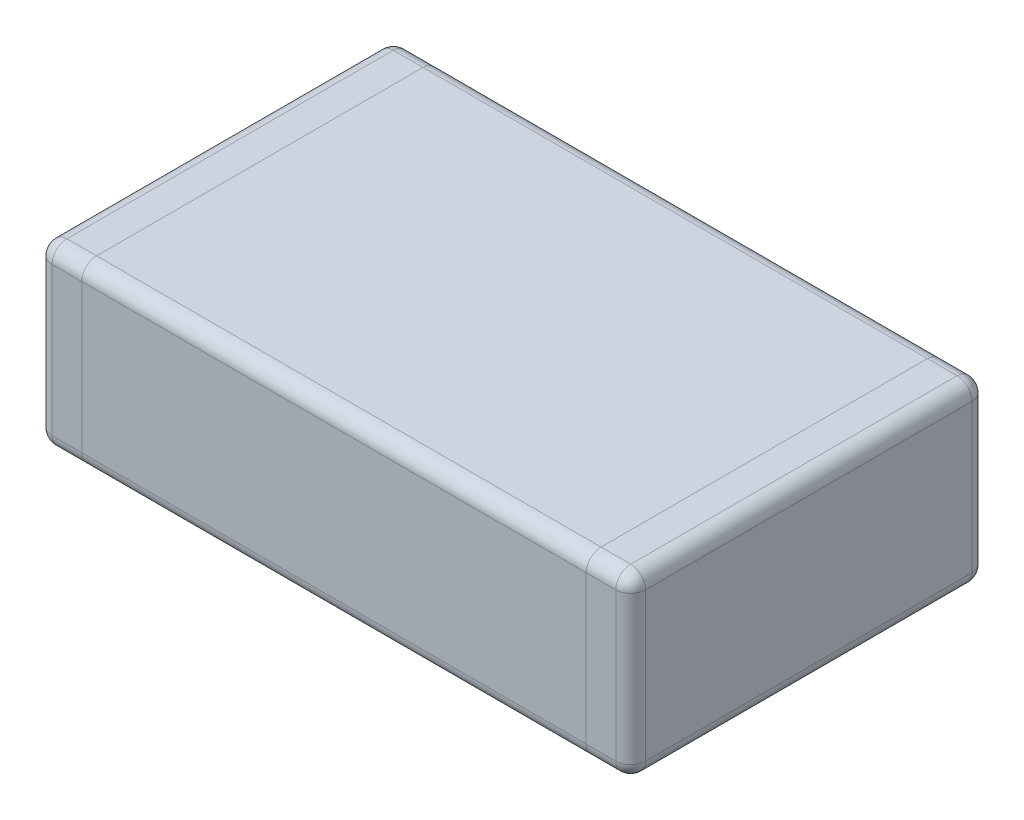
ISO-10303-21;
HEADER;
FILE_DESCRIPTION(('STEP AP214'),'2;1');
FILE_NAME('part.step','',(''),(''),'','','');
FILE_SCHEMA(('AUTOMOTIVE_DESIGN { 1 0 10303 214 1 1 1 1 }'));
ENDSEC;
DATA;
#1=APPLICATION_CONTEXT('core data for automotive mechanical design processes');
#2=APPLICATION_PROTOCOL_DEFINITION('international standard','automotive_design',2000,#1);
#3=PRODUCT_CONTEXT('',#1,'mechanical');
#4=PRODUCT('Part','Part','',(#3));
#5=PRODUCT_RELATED_PRODUCT_CATEGORY('part','',(#4));
#6=PRODUCT_DEFINITION_FORMATION('','',#4);
#7=PRODUCT_DEFINITION_CONTEXT('part definition',#1,'design');
#8=PRODUCT_DEFINITION('design','',#6,#7);
#9=PRODUCT_DEFINITION_SHAPE('','',#8);
#10=(LENGTH_UNIT() NAMED_UNIT(*) SI_UNIT(.MILLI.,.METRE.));
#11=(NAMED_UNIT(*) PLANE_ANGLE_UNIT() SI_UNIT($,.RADIAN.));
#12=(NAMED_UNIT(*) SI_UNIT($,.STERADIAN.) SOLID_ANGLE_UNIT());
#13=UNCERTAINTY_MEASURE_WITH_UNIT(LENGTH_MEASURE(1.E-05),#10,'distance_accuracy_value','');
#14=(GEOMETRIC_REPRESENTATION_CONTEXT(3) GLOBAL_UNCERTAINTY_ASSIGNED_CONTEXT((#13)) GLOBAL_UNIT_ASSIGNED_CONTEXT((#10,
#11,#12)) REPRESENTATION_CONTEXT('',''));
#15=CARTESIAN_POINT('',(0.,0.,0.));
#16=DIRECTION('',(0.,0.,1.));
#17=DIRECTION('',(1.,0.,0.));
#18=AXIS2_PLACEMENT_3D('',#15,#16,#17);
#19=CARTESIAN_POINT('',(1.,0.6,-0.6));
#20=DIRECTION('',(0.,-1.,0.));
#21=DIRECTION('',(0.,0.,-1.));
#22=AXIS2_PLACEMENT_3D('',#19,#20,#21);
#23=PLANE('',#22);
#24=DIRECTION('',(0.,0.,1.));
#25=VECTOR('',#24,1.);
#26=CARTESIAN_POINT('',(-0.85,0.6,-0.6));
#27=LINE('',#26,#25);
#28=CARTESIAN_POINT('',(-0.85,0.6,-0.55));
#29=VERTEX_POINT('',#28);
#30=CARTESIAN_POINT('',(-0.85,0.6,0.55));
#31=VERTEX_POINT('',#30);
#32=EDGE_CURVE('E11',#29,#31,#27,.T.);
#33=ORIENTED_EDGE('',*,*,#32,.F.);
#34=DIRECTION('',(-1.,0.,0.));
#35=VECTOR('',#34,1.);
#36=CARTESIAN_POINT('',(1.,0.6,-0.55));
#37=LINE('',#36,#35);
#38=CARTESIAN_POINT('',(-0.95,0.6,-0.55));
#39=VERTEX_POINT('',#38);
#40=EDGE_CURVE('E286',#29,#39,#37,.T.);
#41=ORIENTED_EDGE('',*,*,#40,.T.);
#42=DIRECTION('',(0.,0.,1.));
#43=VECTOR('',#42,1.);
#44=CARTESIAN_POINT('',(-0.95,0.6,-0.6));
#45=LINE('',#44,#43);
#46=CARTESIAN_POINT('',(-0.95,0.6,0.55));
#47=VERTEX_POINT('',#46);
#48=EDGE_CURVE('E290',#39,#47,#45,.T.);
#49=ORIENTED_EDGE('',*,*,#48,.T.);
#50=DIRECTION('',(1.,0.,0.));
#51=VECTOR('',#50,1.);
#52=CARTESIAN_POINT('',(1.,0.6,0.55));
#53=LINE('',#52,#51);
#54=EDGE_CURVE('E295',#47,#31,#53,.T.);
#55=ORIENTED_EDGE('',*,*,#54,.T.);
#56=EDGE_LOOP('',(#33,#41,#49,#55));
#57=FACE_BOUND('',#56,.T.);
#58=ADVANCED_FACE('F47',(#57),#23,.F.);
#59=DIRECTION('',(0.,0.,-1.));
#60=VECTOR('',#59,1.);
#61=CARTESIAN_POINT('',(0.85,0.6,-0.6));
#62=LINE('',#61,#60);
#63=CARTESIAN_POINT('',(0.85,0.6,0.55));
#64=VERTEX_POINT('',#63);
#65=CARTESIAN_POINT('',(0.85,0.6,-0.55));
#66=VERTEX_POINT('',#65);
#67=EDGE_CURVE('E57',#64,#66,#62,.T.);
#68=ORIENTED_EDGE('',*,*,#67,.F.);
#69=CARTESIAN_POINT('',(0.95,0.6,0.55));
#70=VERTEX_POINT('',#69);
#71=EDGE_CURVE('E294',#64,#70,#53,.T.);
#72=ORIENTED_EDGE('',*,*,#71,.T.);
#73=DIRECTION('',(0.,0.,-1.));
#74=VECTOR('',#73,1.);
#75=CARTESIAN_POINT('',(0.95,0.6,-0.6));
#76=LINE('',#75,#74);
#77=CARTESIAN_POINT('',(0.95,0.6,-0.55));
#78=VERTEX_POINT('',#77);
#79=EDGE_CURVE('E282',#70,#78,#76,.T.);
#80=ORIENTED_EDGE('',*,*,#79,.T.);
#81=EDGE_CURVE('E287',#78,#66,#37,.T.);
#82=ORIENTED_EDGE('',*,*,#81,.T.);
#83=EDGE_LOOP('',(#68,#72,#80,#82));
#84=FACE_BOUND('',#83,.T.);
#85=ADVANCED_FACE('F602',(#84),#23,.F.);
#86=CARTESIAN_POINT('',(1.,0.55,0.55));
#87=DIRECTION('',(1.,0.,0.));
#88=DIRECTION('',(0.,0.,-1.));
#89=AXIS2_PLACEMENT_3D('',#86,#87,#88);
#90=CYLINDRICAL_SURFACE('',#89,0.05);
#91=DIRECTION('',(1.,0.,0.));
#92=VECTOR('',#91,1.);
#93=CARTESIAN_POINT('',(-1.,0.55,0.6));
#94=LINE('',#93,#92);
#95=CARTESIAN_POINT('',(-0.85,0.55,0.6));
#96=VERTEX_POINT('',#95);
#97=CARTESIAN_POINT('',(-0.95,0.55,0.6));
#98=VERTEX_POINT('',#97);
#99=EDGE_CURVE('E277',#96,#98,#94,.F.);
#100=ORIENTED_EDGE('',*,*,#99,.F.);
#101=CARTESIAN_POINT('',(-0.85,0.55,0.55));
#102=DIRECTION('',(1.,0.,0.));
#103=DIRECTION('',(0.,0.,-1.));
#104=AXIS2_PLACEMENT_3D('',#101,#102,#103);
#105=CIRCLE('',#104,0.05);
#106=EDGE_CURVE('E416',#96,#31,#105,.F.);
#107=ORIENTED_EDGE('',*,*,#106,.T.);
#108=ORIENTED_EDGE('',*,*,#54,.F.);
#109=CARTESIAN_POINT('',(-0.95,0.55,0.55));
#110=DIRECTION('',(-1.,0.,0.));
#111=DIRECTION('',(0.,-1.,0.));
#112=AXIS2_PLACEMENT_3D('',#109,#110,#111);
#113=CIRCLE('',#112,0.05);
#114=EDGE_CURVE('E389',#47,#98,#113,.F.);
#115=ORIENTED_EDGE('',*,*,#114,.T.);
#116=EDGE_LOOP('',(#100,#107,#108,#115));
#117=FACE_BOUND('',#116,.T.);
#118=ADVANCED_FACE('F591',(#117),#90,.T.);
#119=ORIENTED_EDGE('',*,*,#71,.F.);
#120=CARTESIAN_POINT('',(0.85,0.55,0.55));
#121=DIRECTION('',(-1.,0.,0.));
#122=DIRECTION('',(0.,0.,1.));
#123=AXIS2_PLACEMENT_3D('',#120,#121,#122);
#124=CIRCLE('',#123,0.05);
#125=CARTESIAN_POINT('',(0.85,0.55,0.6));
#126=VERTEX_POINT('',#125);
#127=EDGE_CURVE('E415',#64,#126,#124,.F.);
#128=ORIENTED_EDGE('',*,*,#127,.T.);
#129=CARTESIAN_POINT('',(0.95,0.55,0.6));
#130=VERTEX_POINT('',#129);
#131=EDGE_CURVE('E278',#130,#126,#94,.F.);
#132=ORIENTED_EDGE('',*,*,#131,.F.);
#133=CARTESIAN_POINT('',(0.95,0.55,0.55));
#134=DIRECTION('',(1.,0.,0.));
#135=DIRECTION('',(0.,0.,-1.));
#136=AXIS2_PLACEMENT_3D('',#133,#134,#135);
#137=CIRCLE('',#136,0.05);
#138=EDGE_CURVE('E369',#70,#130,#137,.T.);
#139=ORIENTED_EDGE('',*,*,#138,.F.);
#140=EDGE_LOOP('',(#119,#128,#132,#139));
#141=FACE_BOUND('',#140,.T.);
#142=ADVANCED_FACE('F615',(#141),#90,.T.);
#143=CARTESIAN_POINT('',(-1.,0.6,0.6));
#144=DIRECTION('',(0.,0.,-1.));
#145=DIRECTION('',(-1.,0.,0.));
#146=AXIS2_PLACEMENT_3D('',#143,#144,#145);
#147=PLANE('',#146);
#148=DIRECTION('',(0.,-1.,0.));
#149=VECTOR('',#148,1.);
#150=CARTESIAN_POINT('',(-0.85,0.6,0.6));
#151=LINE('',#150,#149);
#152=CARTESIAN_POINT('',(-0.85,0.05,0.6));
#153=VERTEX_POINT('',#152);
#154=EDGE_CURVE('E411',#96,#153,#151,.T.);
#155=ORIENTED_EDGE('',*,*,#154,.F.);
#156=ORIENTED_EDGE('',*,*,#99,.T.);
#157=DIRECTION('',(0.,-1.,0.));
#158=VECTOR('',#157,1.);
#159=CARTESIAN_POINT('',(-0.95,0.6,0.6));
#160=LINE('',#159,#158);
#161=CARTESIAN_POINT('',(-0.95,0.05,0.6));
#162=VERTEX_POINT('',#161);
#163=EDGE_CURVE('E273',#98,#162,#160,.T.);
#164=ORIENTED_EDGE('',*,*,#163,.T.);
#165=DIRECTION('',(1.,0.,0.));
#166=VECTOR('',#165,1.);
#167=CARTESIAN_POINT('',(1.,0.05,0.6));
#168=LINE('',#167,#166);
#169=EDGE_CURVE('E265',#162,#153,#168,.T.);
#170=ORIENTED_EDGE('',*,*,#169,.T.);
#171=EDGE_LOOP('',(#155,#156,#164,#170));
#172=FACE_BOUND('',#171,.T.);
#173=ADVANCED_FACE('F662',(#172),#147,.F.);
#174=DIRECTION('',(0.,1.,0.));
#175=VECTOR('',#174,1.);
#176=CARTESIAN_POINT('',(0.85,0.6,0.6));
#177=LINE('',#176,#175);
#178=CARTESIAN_POINT('',(0.85,0.05,0.6));
#179=VERTEX_POINT('',#178);
#180=EDGE_CURVE('E407',#179,#126,#177,.T.);
#181=ORIENTED_EDGE('',*,*,#180,.F.);
#182=CARTESIAN_POINT('',(0.95,0.05,0.6));
#183=VERTEX_POINT('',#182);
#184=EDGE_CURVE('E264',#179,#183,#168,.T.);
#185=ORIENTED_EDGE('',*,*,#184,.T.);
#186=DIRECTION('',(0.,-1.,0.));
#187=VECTOR('',#186,1.);
#188=CARTESIAN_POINT('',(0.95,0.6,0.6));
#189=LINE('',#188,#187);
#190=EDGE_CURVE('E269',#183,#130,#189,.F.);
#191=ORIENTED_EDGE('',*,*,#190,.T.);
#192=ORIENTED_EDGE('',*,*,#131,.T.);
#193=EDGE_LOOP('',(#181,#185,#191,#192));
#194=FACE_BOUND('',#193,.T.);
#195=ADVANCED_FACE('F663',(#194),#147,.F.);
#196=CARTESIAN_POINT('',(-1.,0.05,0.55));
#197=DIRECTION('',(-1.,0.,0.));
#198=DIRECTION('',(0.,0.,1.));
#199=AXIS2_PLACEMENT_3D('',#196,#197,#198);
#200=CYLINDRICAL_SURFACE('',#199,0.05);
#201=DIRECTION('',(1.,0.,0.));
#202=VECTOR('',#201,1.);
#203=CARTESIAN_POINT('',(-1.,0.,0.55));
#204=LINE('',#203,#202);
#205=CARTESIAN_POINT('',(-0.85,0.,0.55));
#206=VERTEX_POINT('',#205);
#207=CARTESIAN_POINT('',(-0.95,0.,0.55));
#208=VERTEX_POINT('',#207);
#209=EDGE_CURVE('E303',#206,#208,#204,.F.);
#210=ORIENTED_EDGE('',*,*,#209,.F.);
#211=CARTESIAN_POINT('',(-0.85,0.05,0.55));
#212=DIRECTION('',(1.,0.,0.));
#213=DIRECTION('',(0.,0.,-1.));
#214=AXIS2_PLACEMENT_3D('',#211,#212,#213);
#215=CIRCLE('',#214,0.05);
#216=EDGE_CURVE('E412',#206,#153,#215,.F.);
#217=ORIENTED_EDGE('',*,*,#216,.T.);
#218=ORIENTED_EDGE('',*,*,#169,.F.);
#219=CARTESIAN_POINT('',(-0.95,0.05,0.55));
#220=DIRECTION('',(-1.,0.,0.));
#221=DIRECTION('',(0.,0.,1.));
#222=AXIS2_PLACEMENT_3D('',#219,#220,#221);
#223=CIRCLE('',#222,0.05);
#224=EDGE_CURVE('E377',#162,#208,#223,.F.);
#225=ORIENTED_EDGE('',*,*,#224,.T.);
#226=EDGE_LOOP('',(#210,#217,#218,#225));
#227=FACE_BOUND('',#226,.T.);
#228=ADVANCED_FACE('F672',(#227),#200,.T.);
#229=ORIENTED_EDGE('',*,*,#184,.F.);
#230=CARTESIAN_POINT('',(0.85,0.05,0.55));
#231=DIRECTION('',(-1.,0.,0.));
#232=DIRECTION('',(0.,0.,1.));
#233=AXIS2_PLACEMENT_3D('',#230,#231,#232);
#234=CIRCLE('',#233,0.05);
#235=CARTESIAN_POINT('',(0.85,0.,0.55));
#236=VERTEX_POINT('',#235);
#237=EDGE_CURVE('E427',#179,#236,#234,.F.);
#238=ORIENTED_EDGE('',*,*,#237,.T.);
#239=CARTESIAN_POINT('',(0.95,0.,0.55));
#240=VERTEX_POINT('',#239);
#241=EDGE_CURVE('E304',#240,#236,#204,.F.);
#242=ORIENTED_EDGE('',*,*,#241,.F.);
#243=CARTESIAN_POINT('',(0.95,0.05,0.55));
#244=DIRECTION('',(1.,0.,0.));
#245=DIRECTION('',(0.,0.,-1.));
#246=AXIS2_PLACEMENT_3D('',#243,#244,#245);
#247=CIRCLE('',#246,0.05);
#248=EDGE_CURVE('E350',#183,#240,#247,.T.);
#249=ORIENTED_EDGE('',*,*,#248,.F.);
#250=EDGE_LOOP('',(#229,#238,#242,#249));
#251=FACE_BOUND('',#250,.T.);
#252=ADVANCED_FACE('F631',(#251),#200,.T.);
#253=CARTESIAN_POINT('',(1.,0.,-0.6));
#254=DIRECTION('',(0.,-1.,0.));
#255=DIRECTION('',(0.,0.,-1.));
#256=AXIS2_PLACEMENT_3D('',#253,#254,#255);
#257=PLANE('',#256);
#258=DIRECTION('',(-1.,0.,0.));
#259=VECTOR('',#258,1.);
#260=CARTESIAN_POINT('',(1.,0.,-0.55));
#261=LINE('',#260,#259);
#262=CARTESIAN_POINT('',(-0.95,0.,-0.55));
#263=VERTEX_POINT('',#262);
#264=CARTESIAN_POINT('',(-0.85,0.,-0.55));
#265=VERTEX_POINT('',#264);
#266=EDGE_CURVE('E313',#263,#265,#261,.F.);
#267=ORIENTED_EDGE('',*,*,#266,.T.);
#268=DIRECTION('',(0.,0.,1.));
#269=VECTOR('',#268,1.);
#270=CARTESIAN_POINT('',(-0.85,0.,-0.6));
#271=LINE('',#270,#269);
#272=EDGE_CURVE('E428',#265,#206,#271,.T.);
#273=ORIENTED_EDGE('',*,*,#272,.T.);
#274=ORIENTED_EDGE('',*,*,#209,.T.);
#275=DIRECTION('',(0.,0.,1.));
#276=VECTOR('',#275,1.);
#277=CARTESIAN_POINT('',(-0.95,0.,-0.6));
#278=LINE('',#277,#276);
#279=EDGE_CURVE('E308',#208,#263,#278,.F.);
#280=ORIENTED_EDGE('',*,*,#279,.T.);
#281=EDGE_LOOP('',(#267,#273,#274,#280));
#282=FACE_BOUND('',#281,.T.);
#283=ADVANCED_FACE('F659',(#282),#257,.T.);
#284=ORIENTED_EDGE('',*,*,#241,.T.);
#285=DIRECTION('',(0.,0.,-1.));
#286=VECTOR('',#285,1.);
#287=CARTESIAN_POINT('',(0.85,0.,-0.6));
#288=LINE('',#287,#286);
#289=CARTESIAN_POINT('',(0.85,0.,-0.55));
#290=VERTEX_POINT('',#289);
#291=EDGE_CURVE('E422',#236,#290,#288,.T.);
#292=ORIENTED_EDGE('',*,*,#291,.T.);
#293=CARTESIAN_POINT('',(0.95,0.,-0.55));
#294=VERTEX_POINT('',#293);
#295=EDGE_CURVE('E312',#290,#294,#261,.F.);
#296=ORIENTED_EDGE('',*,*,#295,.T.);
#297=DIRECTION('',(0.,0.,-1.));
#298=VECTOR('',#297,1.);
#299=CARTESIAN_POINT('',(0.95,0.,0.6));
#300=LINE('',#299,#298);
#301=EDGE_CURVE('E299',#294,#240,#300,.F.);
#302=ORIENTED_EDGE('',*,*,#301,.T.);
#303=EDGE_LOOP('',(#284,#292,#296,#302));
#304=FACE_BOUND('',#303,.T.);
#305=ADVANCED_FACE('F449',(#304),#257,.T.);
#306=CARTESIAN_POINT('',(1.,0.55,-0.55));
#307=DIRECTION('',(-1.,0.,0.));
#308=DIRECTION('',(0.,0.,1.));
#309=AXIS2_PLACEMENT_3D('',#306,#307,#308);
#310=CYLINDRICAL_SURFACE('',#309,0.05);
#311=ORIENTED_EDGE('',*,*,#40,.F.);
#312=CARTESIAN_POINT('',(-0.85,0.55,-0.55));
#313=DIRECTION('',(1.,0.,0.));
#314=DIRECTION('',(0.,0.,-1.));
#315=AXIS2_PLACEMENT_3D('',#312,#313,#314);
#316=CIRCLE('',#315,0.05);
#317=CARTESIAN_POINT('',(-0.85,0.55,-0.6));
#318=VERTEX_POINT('',#317);
#319=EDGE_CURVE('E419',#29,#318,#316,.F.);
#320=ORIENTED_EDGE('',*,*,#319,.T.);
#321=DIRECTION('',(-1.,0.,0.));
#322=VECTOR('',#321,1.);
#323=CARTESIAN_POINT('',(-1.,0.55,-0.6));
#324=LINE('',#323,#322);
#325=CARTESIAN_POINT('',(-0.95,0.55,-0.6));
#326=VERTEX_POINT('',#325);
#327=EDGE_CURVE('E234',#326,#318,#324,.F.);
#328=ORIENTED_EDGE('',*,*,#327,.F.);
#329=CARTESIAN_POINT('',(-0.95,0.55,-0.55));
#330=DIRECTION('',(-1.,0.,0.));
#331=DIRECTION('',(0.,0.,1.));
#332=AXIS2_PLACEMENT_3D('',#329,#330,#331);
#333=CIRCLE('',#332,0.05);
#334=EDGE_CURVE('E338',#326,#39,#333,.F.);
#335=ORIENTED_EDGE('',*,*,#334,.T.);
#336=EDGE_LOOP('',(#311,#320,#328,#335));
#337=FACE_BOUND('',#336,.T.);
#338=ADVANCED_FACE('F568',(#337),#310,.T.);
#339=CARTESIAN_POINT('',(0.85,0.55,-0.6));
#340=VERTEX_POINT('',#339);
#341=CARTESIAN_POINT('',(0.95,0.55,-0.6));
#342=VERTEX_POINT('',#341);
#343=EDGE_CURVE('E224',#340,#342,#324,.F.);
#344=ORIENTED_EDGE('',*,*,#343,.F.);
#345=CARTESIAN_POINT('',(0.85,0.55,-0.55));
#346=DIRECTION('',(-1.,0.,0.));
#347=DIRECTION('',(0.,0.,1.));
#348=AXIS2_PLACEMENT_3D('',#345,#346,#347);
#349=CIRCLE('',#348,0.05);
#350=EDGE_CURVE('E423',#340,#66,#349,.F.);
#351=ORIENTED_EDGE('',*,*,#350,.T.);
#352=ORIENTED_EDGE('',*,*,#81,.F.);
#353=CARTESIAN_POINT('',(0.95,0.55,-0.55));
#354=DIRECTION('',(1.,0.,0.));
#355=DIRECTION('',(0.,1.,0.));
#356=AXIS2_PLACEMENT_3D('',#353,#354,#355);
#357=CIRCLE('',#356,0.05);
#358=EDGE_CURVE('E208',#342,#78,#357,.T.);
#359=ORIENTED_EDGE('',*,*,#358,.F.);
#360=EDGE_LOOP('',(#344,#351,#352,#359));
#361=FACE_BOUND('',#360,.T.);
#362=ADVANCED_FACE('F745',(#361),#310,.T.);
#363=CARTESIAN_POINT('',(-1.,0.05,-0.55));
#364=DIRECTION('',(1.,0.,0.));
#365=DIRECTION('',(0.,0.,-1.));
#366=AXIS2_PLACEMENT_3D('',#363,#364,#365);
#367=CYLINDRICAL_SURFACE('',#366,0.05);
#368=DIRECTION('',(-1.,0.,0.));
#369=VECTOR('',#368,1.);
#370=CARTESIAN_POINT('',(-1.,0.05,-0.6));
#371=LINE('',#370,#369);
#372=CARTESIAN_POINT('',(-0.85,0.05,-0.6));
#373=VERTEX_POINT('',#372);
#374=CARTESIAN_POINT('',(-0.95,0.05,-0.6));
#375=VERTEX_POINT('',#374);
#376=EDGE_CURVE('E221',#373,#375,#371,.T.);
#377=ORIENTED_EDGE('',*,*,#376,.F.);
#378=CARTESIAN_POINT('',(-0.85,0.05,-0.55));
#379=DIRECTION('',(1.,0.,0.));
#380=DIRECTION('',(0.,0.,-1.));
#381=AXIS2_PLACEMENT_3D('',#378,#379,#380);
#382=CIRCLE('',#381,0.05);
#383=EDGE_CURVE('E432',#373,#265,#382,.F.);
#384=ORIENTED_EDGE('',*,*,#383,.T.);
#385=ORIENTED_EDGE('',*,*,#266,.F.);
#386=CARTESIAN_POINT('',(-0.95,0.05,-0.55));
#387=DIRECTION('',(-1.,0.,0.));
#388=DIRECTION('',(0.,0.,1.));
#389=AXIS2_PLACEMENT_3D('',#386,#387,#388);
#390=CIRCLE('',#389,0.05);
#391=EDGE_CURVE('E334',#263,#375,#390,.F.);
#392=ORIENTED_EDGE('',*,*,#391,.T.);
#393=EDGE_LOOP('',(#377,#384,#385,#392));
#394=FACE_BOUND('',#393,.T.);
#395=ADVANCED_FACE('F709',(#394),#367,.T.);
#396=ORIENTED_EDGE('',*,*,#295,.F.);
#397=CARTESIAN_POINT('',(0.85,0.05,-0.55));
#398=DIRECTION('',(-1.,0.,0.));
#399=DIRECTION('',(0.,0.,1.));
#400=AXIS2_PLACEMENT_3D('',#397,#398,#399);
#401=CIRCLE('',#400,0.05);
#402=CARTESIAN_POINT('',(0.85,0.05,-0.6));
#403=VERTEX_POINT('',#402);
#404=EDGE_CURVE('E51',#290,#403,#401,.F.);
#405=ORIENTED_EDGE('',*,*,#404,.T.);
#406=CARTESIAN_POINT('',(0.95,0.05,-0.6));
#407=VERTEX_POINT('',#406);
#408=EDGE_CURVE('E211',#407,#403,#371,.T.);
#409=ORIENTED_EDGE('',*,*,#408,.F.);
#410=CARTESIAN_POINT('',(0.95,0.05,-0.55));
#411=DIRECTION('',(1.,0.,0.));
#412=DIRECTION('',(0.,0.,-1.));
#413=AXIS2_PLACEMENT_3D('',#410,#411,#412);
#414=CIRCLE('',#413,0.05);
#415=EDGE_CURVE('E199',#294,#407,#414,.T.);
#416=ORIENTED_EDGE('',*,*,#415,.F.);
#417=EDGE_LOOP('',(#396,#405,#409,#416));
#418=FACE_BOUND('',#417,.T.);
#419=ADVANCED_FACE('F212',(#418),#367,.T.);
#420=CARTESIAN_POINT('',(-1.,0.6,-0.6));
#421=DIRECTION('',(0.,0.,1.));
#422=DIRECTION('',(1.,0.,0.));
#423=AXIS2_PLACEMENT_3D('',#420,#421,#422);
#424=PLANE('',#423);
#425=DIRECTION('',(0.,1.,0.));
#426=VECTOR('',#425,1.);
#427=CARTESIAN_POINT('',(-0.85,0.6,-0.6));
#428=LINE('',#427,#426);
#429=EDGE_CURVE('E403',#373,#318,#428,.T.);
#430=ORIENTED_EDGE('',*,*,#429,.F.);
#431=ORIENTED_EDGE('',*,*,#376,.T.);
#432=DIRECTION('',(0.,-1.,0.));
#433=VECTOR('',#432,1.);
#434=CARTESIAN_POINT('',(-0.95,0.6,-0.6));
#435=LINE('',#434,#433);
#436=EDGE_CURVE('E218',#375,#326,#435,.F.);
#437=ORIENTED_EDGE('',*,*,#436,.T.);
#438=ORIENTED_EDGE('',*,*,#327,.T.);
#439=EDGE_LOOP('',(#430,#431,#437,#438));
#440=FACE_BOUND('',#439,.T.);
#441=ADVANCED_FACE('F571',(#440),#424,.F.);
#442=DIRECTION('',(0.,-1.,0.));
#443=VECTOR('',#442,1.);
#444=CARTESIAN_POINT('',(0.85,0.6,-0.6));
#445=LINE('',#444,#443);
#446=EDGE_CURVE('E316',#340,#403,#445,.T.);
#447=ORIENTED_EDGE('',*,*,#446,.F.);
#448=ORIENTED_EDGE('',*,*,#343,.T.);
#449=DIRECTION('',(0.,-1.,0.));
#450=VECTOR('',#449,1.);
#451=CARTESIAN_POINT('',(0.95,0.6,-0.6));
#452=LINE('',#451,#450);
#453=EDGE_CURVE('E190',#342,#407,#452,.T.);
#454=ORIENTED_EDGE('',*,*,#453,.T.);
#455=ORIENTED_EDGE('',*,*,#408,.T.);
#456=EDGE_LOOP('',(#447,#448,#454,#455));
#457=FACE_BOUND('',#456,.T.);
#458=ADVANCED_FACE('F222',(#457),#424,.F.);
#459=CARTESIAN_POINT('',(1.,0.6,0.6));
#460=DIRECTION('',(-1.,0.,0.));
#461=DIRECTION('',(0.,0.,1.));
#462=AXIS2_PLACEMENT_3D('',#459,#460,#461);
#463=PLANE('',#462);
#464=DIRECTION('',(0.,-1.,0.));
#465=VECTOR('',#464,1.);
#466=CARTESIAN_POINT('',(1.,0.6,-0.55));
#467=LINE('',#466,#465);
#468=CARTESIAN_POINT('',(1.,0.05,-0.55));
#469=VERTEX_POINT('',#468);
#470=CARTESIAN_POINT('',(1.,0.55,-0.55));
#471=VERTEX_POINT('',#470);
#472=EDGE_CURVE('E192',#469,#471,#467,.F.);
#473=ORIENTED_EDGE('',*,*,#472,.T.);
#474=DIRECTION('',(0.,0.,-1.));
#475=VECTOR('',#474,1.);
#476=CARTESIAN_POINT('',(1.,0.55,0.6));
#477=LINE('',#476,#475);
#478=CARTESIAN_POINT('',(1.,0.55,0.55));
#479=VERTEX_POINT('',#478);
#480=EDGE_CURVE('E248',#471,#479,#477,.F.);
#481=ORIENTED_EDGE('',*,*,#480,.T.);
#482=DIRECTION('',(0.,-1.,0.));
#483=VECTOR('',#482,1.);
#484=CARTESIAN_POINT('',(1.,0.6,0.55));
#485=LINE('',#484,#483);
#486=CARTESIAN_POINT('',(1.,0.05,0.55));
#487=VERTEX_POINT('',#486);
#488=EDGE_CURVE('E243',#479,#487,#485,.T.);
#489=ORIENTED_EDGE('',*,*,#488,.T.);
#490=DIRECTION('',(0.,0.,-1.));
#491=VECTOR('',#490,1.);
#492=CARTESIAN_POINT('',(1.,0.05,-0.6));
#493=LINE('',#492,#491);
#494=EDGE_CURVE('E240',#487,#469,#493,.T.);
#495=ORIENTED_EDGE('',*,*,#494,.T.);
#496=EDGE_LOOP('',(#473,#481,#489,#495));
#497=FACE_BOUND('',#496,.T.);
#498=ADVANCED_FACE('F625',(#497),#463,.F.);
#499=EDGE_CURVE('E219',#403,#373,#371,.T.);
#500=ORIENTED_EDGE('',*,*,#499,.T.);
#501=ORIENTED_EDGE('',*,*,#429,.T.);
#502=EDGE_CURVE('E232',#318,#340,#324,.F.);
#503=ORIENTED_EDGE('',*,*,#502,.T.);
#504=ORIENTED_EDGE('',*,*,#446,.T.);
#505=EDGE_LOOP('',(#500,#501,#503,#504));
#506=FACE_BOUND('',#505,.T.);
#507=ADVANCED_FACE('F667',(#506),#424,.F.);
#508=CARTESIAN_POINT('',(-1.,0.6,0.6));
#509=DIRECTION('',(1.,0.,0.));
#510=DIRECTION('',(0.,0.,-1.));
#511=AXIS2_PLACEMENT_3D('',#508,#509,#510);
#512=PLANE('',#511);
#513=DIRECTION('',(0.,-1.,0.));
#514=VECTOR('',#513,1.);
#515=CARTESIAN_POINT('',(-1.,0.6,0.55));
#516=LINE('',#515,#514);
#517=CARTESIAN_POINT('',(-1.,0.05,0.55));
#518=VERTEX_POINT('',#517);
#519=CARTESIAN_POINT('',(-1.,0.55,0.55));
#520=VERTEX_POINT('',#519);
#521=EDGE_CURVE('E254',#518,#520,#516,.F.);
#522=ORIENTED_EDGE('',*,*,#521,.T.);
#523=DIRECTION('',(0.,0.,1.));
#524=VECTOR('',#523,1.);
#525=CARTESIAN_POINT('',(-1.,0.55,0.6));
#526=LINE('',#525,#524);
#527=CARTESIAN_POINT('',(-1.,0.55,-0.55));
#528=VERTEX_POINT('',#527);
#529=EDGE_CURVE('E261',#520,#528,#526,.F.);
#530=ORIENTED_EDGE('',*,*,#529,.T.);
#531=DIRECTION('',(0.,-1.,0.));
#532=VECTOR('',#531,1.);
#533=CARTESIAN_POINT('',(-1.,0.6,-0.55));
#534=LINE('',#533,#532);
#535=CARTESIAN_POINT('',(-1.,0.05,-0.55));
#536=VERTEX_POINT('',#535);
#537=EDGE_CURVE('E257',#528,#536,#534,.T.);
#538=ORIENTED_EDGE('',*,*,#537,.T.);
#539=DIRECTION('',(0.,0.,1.));
#540=VECTOR('',#539,1.);
#541=CARTESIAN_POINT('',(-1.,0.05,0.6));
#542=LINE('',#541,#540);
#543=EDGE_CURVE('E251',#536,#518,#542,.T.);
#544=ORIENTED_EDGE('',*,*,#543,.T.);
#545=EDGE_LOOP('',(#522,#530,#538,#544));
#546=FACE_BOUND('',#545,.T.);
#547=ADVANCED_FACE('F580',(#546),#512,.F.);
#548=EDGE_CURVE('E283',#126,#96,#94,.F.);
#549=ORIENTED_EDGE('',*,*,#548,.T.);
#550=ORIENTED_EDGE('',*,*,#154,.T.);
#551=EDGE_CURVE('E270',#153,#179,#168,.T.);
#552=ORIENTED_EDGE('',*,*,#551,.T.);
#553=ORIENTED_EDGE('',*,*,#180,.T.);
#554=EDGE_LOOP('',(#549,#550,#552,#553));
#555=FACE_BOUND('',#554,.T.);
#556=ADVANCED_FACE('F654',(#555),#147,.F.);
#557=EDGE_CURVE('E291',#66,#29,#37,.T.);
#558=ORIENTED_EDGE('',*,*,#557,.T.);
#559=ORIENTED_EDGE('',*,*,#32,.T.);
#560=EDGE_CURVE('E300',#31,#64,#53,.T.);
#561=ORIENTED_EDGE('',*,*,#560,.T.);
#562=ORIENTED_EDGE('',*,*,#67,.T.);
#563=EDGE_LOOP('',(#558,#559,#561,#562));
#564=FACE_BOUND('',#563,.T.);
#565=ADVANCED_FACE('F648',(#564),#23,.F.);
#566=ORIENTED_EDGE('',*,*,#272,.F.);
#567=EDGE_CURVE('E317',#265,#290,#261,.F.);
#568=ORIENTED_EDGE('',*,*,#567,.T.);
#569=ORIENTED_EDGE('',*,*,#291,.F.);
#570=EDGE_CURVE('E309',#236,#206,#204,.F.);
#571=ORIENTED_EDGE('',*,*,#570,.T.);
#572=EDGE_LOOP('',(#566,#568,#569,#571));
#573=FACE_BOUND('',#572,.T.);
#574=ADVANCED_FACE('F461',(#573),#257,.T.);
#575=CARTESIAN_POINT('',(-0.95,0.6,0.55));
#576=DIRECTION('',(0.,-1.,0.));
#577=DIRECTION('',(0.,0.,-1.));
#578=AXIS2_PLACEMENT_3D('',#575,#576,#577);
#579=CYLINDRICAL_SURFACE('',#578,0.05);
#580=CARTESIAN_POINT('',(-0.95,0.55,0.55));
#581=DIRECTION('',(0.,1.,0.));
#582=DIRECTION('',(0.,0.,1.));
#583=AXIS2_PLACEMENT_3D('',#580,#581,#582);
#584=CIRCLE('',#583,0.05);
#585=EDGE_CURVE('E397',#520,#98,#584,.T.);
#586=ORIENTED_EDGE('',*,*,#585,.F.);
#587=ORIENTED_EDGE('',*,*,#521,.F.);
#588=CARTESIAN_POINT('',(-0.95,0.05,0.55));
#589=DIRECTION('',(0.,-1.,0.));
#590=DIRECTION('',(0.,0.,-1.));
#591=AXIS2_PLACEMENT_3D('',#588,#589,#590);
#592=CIRCLE('',#591,0.05);
#593=EDGE_CURVE('E393',#162,#518,#592,.T.);
#594=ORIENTED_EDGE('',*,*,#593,.F.);
#595=ORIENTED_EDGE('',*,*,#163,.F.);
#596=EDGE_LOOP('',(#586,#587,#594,#595));
#597=FACE_BOUND('',#596,.T.);
#598=ADVANCED_FACE('F49',(#597),#579,.T.);
#599=CARTESIAN_POINT('',(-0.95,0.55,0.55));
#600=DIRECTION('',(0.,0.,1.));
#601=DIRECTION('',(1.,0.,0.));
#602=AXIS2_PLACEMENT_3D('',#599,#600,#601);
#603=SPHERICAL_SURFACE('',#602,0.05);
#604=CARTESIAN_POINT('',(-0.95,0.55,0.55));
#605=DIRECTION('',(0.,0.,1.));
#606=DIRECTION('',(1.,0.,0.));
#607=AXIS2_PLACEMENT_3D('',#604,#605,#606);
#608=CIRCLE('',#607,0.05);
#609=EDGE_CURVE('E385',#520,#47,#608,.F.);
#610=ORIENTED_EDGE('',*,*,#609,.F.);
#611=ORIENTED_EDGE('',*,*,#585,.T.);
#612=ORIENTED_EDGE('',*,*,#114,.F.);
#613=EDGE_LOOP('',(#610,#611,#612));
#614=FACE_BOUND('',#613,.T.);
#615=ADVANCED_FACE('F587',(#614),#603,.T.);
#616=CARTESIAN_POINT('',(-0.95,0.05,0.55));
#617=DIRECTION('',(0.,0.,1.));
#618=DIRECTION('',(1.,0.,0.));
#619=AXIS2_PLACEMENT_3D('',#616,#617,#618);
#620=SPHERICAL_SURFACE('',#619,0.05);
#621=ORIENTED_EDGE('',*,*,#224,.F.);
#622=ORIENTED_EDGE('',*,*,#593,.T.);
#623=CARTESIAN_POINT('',(-0.95,0.05,0.55));
#624=DIRECTION('',(0.,0.,1.));
#625=DIRECTION('',(1.,0.,0.));
#626=AXIS2_PLACEMENT_3D('',#623,#624,#625);
#627=CIRCLE('',#626,0.05);
#628=EDGE_CURVE('E381',#208,#518,#627,.F.);
#629=ORIENTED_EDGE('',*,*,#628,.F.);
#630=EDGE_LOOP('',(#621,#622,#629));
#631=FACE_BOUND('',#630,.T.);
#632=ADVANCED_FACE('F703',(#631),#620,.T.);
#633=ORIENTED_EDGE('',*,*,#106,.F.);
#634=ORIENTED_EDGE('',*,*,#548,.F.);
#635=ORIENTED_EDGE('',*,*,#127,.F.);
#636=ORIENTED_EDGE('',*,*,#560,.F.);
#637=EDGE_LOOP('',(#633,#634,#635,#636));
#638=FACE_BOUND('',#637,.T.);
#639=ADVANCED_FACE('F596',(#638),#90,.T.);
#640=CARTESIAN_POINT('',(-0.95,0.55,-0.6));
#641=DIRECTION('',(0.,0.,1.));
#642=DIRECTION('',(1.,0.,0.));
#643=AXIS2_PLACEMENT_3D('',#640,#641,#642);
#644=CYLINDRICAL_SURFACE('',#643,0.05);
#645=ORIENTED_EDGE('',*,*,#609,.T.);
#646=ORIENTED_EDGE('',*,*,#48,.F.);
#647=CARTESIAN_POINT('',(-0.95,0.55,-0.55));
#648=DIRECTION('',(0.,0.,-1.));
#649=DIRECTION('',(0.,1.,0.));
#650=AXIS2_PLACEMENT_3D('',#647,#648,#649);
#651=CIRCLE('',#650,0.05);
#652=EDGE_CURVE('E365',#528,#39,#651,.T.);
#653=ORIENTED_EDGE('',*,*,#652,.F.);
#654=ORIENTED_EDGE('',*,*,#529,.F.);
#655=EDGE_LOOP('',(#645,#646,#653,#654));
#656=FACE_BOUND('',#655,.T.);
#657=ADVANCED_FACE('F559',(#656),#644,.T.);
#658=CARTESIAN_POINT('',(-0.95,0.6,-0.55));
#659=DIRECTION('',(0.,-1.,0.));
#660=DIRECTION('',(0.,0.,-1.));
#661=AXIS2_PLACEMENT_3D('',#658,#659,#660);
#662=CYLINDRICAL_SURFACE('',#661,0.05);
#663=CARTESIAN_POINT('',(-0.95,0.05,-0.55));
#664=DIRECTION('',(0.,-1.,0.));
#665=DIRECTION('',(0.,0.,-1.));
#666=AXIS2_PLACEMENT_3D('',#663,#664,#665);
#667=CIRCLE('',#666,0.05);
#668=EDGE_CURVE('E357',#536,#375,#667,.T.);
#669=ORIENTED_EDGE('',*,*,#668,.F.);
#670=ORIENTED_EDGE('',*,*,#537,.F.);
#671=CARTESIAN_POINT('',(-0.95,0.55,-0.55));
#672=DIRECTION('',(0.,1.,0.));
#673=DIRECTION('',(0.,0.,1.));
#674=AXIS2_PLACEMENT_3D('',#671,#672,#673);
#675=CIRCLE('',#674,0.05);
#676=EDGE_CURVE('E361',#326,#528,#675,.T.);
#677=ORIENTED_EDGE('',*,*,#676,.F.);
#678=ORIENTED_EDGE('',*,*,#436,.F.);
#679=EDGE_LOOP('',(#669,#670,#677,#678));
#680=FACE_BOUND('',#679,.T.);
#681=ADVANCED_FACE('F577',(#680),#662,.T.);
#682=CARTESIAN_POINT('',(-0.95,0.05,0.6));
#683=DIRECTION('',(0.,0.,-1.));
#684=DIRECTION('',(-1.,0.,0.));
#685=AXIS2_PLACEMENT_3D('',#682,#683,#684);
#686=CYLINDRICAL_SURFACE('',#685,0.05);
#687=ORIENTED_EDGE('',*,*,#628,.T.);
#688=ORIENTED_EDGE('',*,*,#543,.F.);
#689=CARTESIAN_POINT('',(-0.95,0.05,-0.55));
#690=DIRECTION('',(0.,0.,-1.));
#691=DIRECTION('',(-1.,0.,0.));
#692=AXIS2_PLACEMENT_3D('',#689,#690,#691);
#693=CIRCLE('',#692,0.05);
#694=EDGE_CURVE('E354',#263,#536,#693,.T.);
#695=ORIENTED_EDGE('',*,*,#694,.F.);
#696=ORIENTED_EDGE('',*,*,#279,.F.);
#697=EDGE_LOOP('',(#687,#688,#695,#696));
#698=FACE_BOUND('',#697,.T.);
#699=ADVANCED_FACE('F705',(#698),#686,.T.);
#700=ORIENTED_EDGE('',*,*,#216,.F.);
#701=ORIENTED_EDGE('',*,*,#570,.F.);
#702=ORIENTED_EDGE('',*,*,#237,.F.);
#703=ORIENTED_EDGE('',*,*,#551,.F.);
#704=EDGE_LOOP('',(#700,#701,#702,#703));
#705=FACE_BOUND('',#704,.T.);
#706=ADVANCED_FACE('F678',(#705),#200,.T.);
#707=CARTESIAN_POINT('',(0.95,0.6,0.55));
#708=DIRECTION('',(0.,-1.,0.));
#709=DIRECTION('',(0.,0.,-1.));
#710=AXIS2_PLACEMENT_3D('',#707,#708,#709);
#711=CYLINDRICAL_SURFACE('',#710,0.05);
#712=CARTESIAN_POINT('',(0.95,0.55,0.55));
#713=DIRECTION('',(0.,1.,0.));
#714=DIRECTION('',(0.,0.,1.));
#715=AXIS2_PLACEMENT_3D('',#712,#713,#714);
#716=CIRCLE('',#715,0.05);
#717=EDGE_CURVE('E373',#130,#479,#716,.T.);
#718=ORIENTED_EDGE('',*,*,#717,.F.);
#719=ORIENTED_EDGE('',*,*,#190,.F.);
#720=CARTESIAN_POINT('',(0.95,0.05,0.55));
#721=DIRECTION('',(0.,-1.,0.));
#722=DIRECTION('',(0.,0.,-1.));
#723=AXIS2_PLACEMENT_3D('',#720,#721,#722);
#724=CIRCLE('',#723,0.05);
#725=EDGE_CURVE('E346',#487,#183,#724,.T.);
#726=ORIENTED_EDGE('',*,*,#725,.F.);
#727=ORIENTED_EDGE('',*,*,#488,.F.);
#728=EDGE_LOOP('',(#718,#719,#726,#727));
#729=FACE_BOUND('',#728,.T.);
#730=ADVANCED_FACE('F620',(#729),#711,.T.);
#731=CARTESIAN_POINT('',(0.95,0.55,0.55));
#732=DIRECTION('',(0.,0.,1.));
#733=DIRECTION('',(1.,0.,0.));
#734=AXIS2_PLACEMENT_3D('',#731,#732,#733);
#735=SPHERICAL_SURFACE('',#734,0.05);
#736=ORIENTED_EDGE('',*,*,#138,.T.);
#737=ORIENTED_EDGE('',*,*,#717,.T.);
#738=CARTESIAN_POINT('',(0.95,0.55,0.55));
#739=DIRECTION('',(0.,0.,1.));
#740=DIRECTION('',(0.,-1.,0.));
#741=AXIS2_PLACEMENT_3D('',#738,#739,#740);
#742=CIRCLE('',#741,0.05);
#743=EDGE_CURVE('E342',#70,#479,#742,.F.);
#744=ORIENTED_EDGE('',*,*,#743,.F.);
#745=EDGE_LOOP('',(#736,#737,#744));
#746=FACE_BOUND('',#745,.T.);
#747=ADVANCED_FACE('F612',(#746),#735,.T.);
#748=CARTESIAN_POINT('',(-0.95,0.55,-0.55));
#749=DIRECTION('',(0.,0.,1.));
#750=DIRECTION('',(1.,0.,0.));
#751=AXIS2_PLACEMENT_3D('',#748,#749,#750);
#752=SPHERICAL_SURFACE('',#751,0.05);
#753=ORIENTED_EDGE('',*,*,#676,.T.);
#754=ORIENTED_EDGE('',*,*,#652,.T.);
#755=ORIENTED_EDGE('',*,*,#334,.F.);
#756=EDGE_LOOP('',(#753,#754,#755));
#757=FACE_BOUND('',#756,.T.);
#758=ADVANCED_FACE('F565',(#757),#752,.T.);
#759=CARTESIAN_POINT('',(-0.95,0.05,-0.55));
#760=DIRECTION('',(0.,0.,1.));
#761=DIRECTION('',(1.,0.,0.));
#762=AXIS2_PLACEMENT_3D('',#759,#760,#761);
#763=SPHERICAL_SURFACE('',#762,0.05);
#764=ORIENTED_EDGE('',*,*,#694,.T.);
#765=ORIENTED_EDGE('',*,*,#668,.T.);
#766=ORIENTED_EDGE('',*,*,#391,.F.);
#767=EDGE_LOOP('',(#764,#765,#766));
#768=FACE_BOUND('',#767,.T.);
#769=ADVANCED_FACE('F636',(#768),#763,.T.);
#770=CARTESIAN_POINT('',(0.95,0.05,0.55));
#771=DIRECTION('',(0.,0.,1.));
#772=DIRECTION('',(1.,0.,0.));
#773=AXIS2_PLACEMENT_3D('',#770,#771,#772);
#774=SPHERICAL_SURFACE('',#773,0.05);
#775=ORIENTED_EDGE('',*,*,#725,.T.);
#776=ORIENTED_EDGE('',*,*,#248,.T.);
#777=CARTESIAN_POINT('',(0.95,0.05,0.55));
#778=DIRECTION('',(0.,0.,1.));
#779=DIRECTION('',(1.,0.,0.));
#780=AXIS2_PLACEMENT_3D('',#777,#778,#779);
#781=CIRCLE('',#780,0.05);
#782=EDGE_CURVE('E330',#487,#240,#781,.F.);
#783=ORIENTED_EDGE('',*,*,#782,.F.);
#784=EDGE_LOOP('',(#775,#776,#783));
#785=FACE_BOUND('',#784,.T.);
#786=ADVANCED_FACE('F634',(#785),#774,.T.);
#787=CARTESIAN_POINT('',(0.95,0.55,-0.6));
#788=DIRECTION('',(0.,0.,-1.));
#789=DIRECTION('',(-1.,0.,0.));
#790=AXIS2_PLACEMENT_3D('',#787,#788,#789);
#791=CYLINDRICAL_SURFACE('',#790,0.05);
#792=ORIENTED_EDGE('',*,*,#743,.T.);
#793=ORIENTED_EDGE('',*,*,#480,.F.);
#794=CARTESIAN_POINT('',(0.95,0.55,-0.55));
#795=DIRECTION('',(0.,0.,-1.));
#796=DIRECTION('',(-1.,0.,0.));
#797=AXIS2_PLACEMENT_3D('',#794,#795,#796);
#798=CIRCLE('',#797,0.05);
#799=EDGE_CURVE('E326',#78,#471,#798,.T.);
#800=ORIENTED_EDGE('',*,*,#799,.F.);
#801=ORIENTED_EDGE('',*,*,#79,.F.);
#802=EDGE_LOOP('',(#792,#793,#800,#801));
#803=FACE_BOUND('',#802,.T.);
#804=ADVANCED_FACE('F609',(#803),#791,.T.);
#805=ORIENTED_EDGE('',*,*,#319,.F.);
#806=ORIENTED_EDGE('',*,*,#557,.F.);
#807=ORIENTED_EDGE('',*,*,#350,.F.);
#808=ORIENTED_EDGE('',*,*,#502,.F.);
#809=EDGE_LOOP('',(#805,#806,#807,#808));
#810=FACE_BOUND('',#809,.T.);
#811=ADVANCED_FACE('F642',(#810),#310,.T.);
#812=ORIENTED_EDGE('',*,*,#383,.F.);
#813=ORIENTED_EDGE('',*,*,#499,.F.);
#814=ORIENTED_EDGE('',*,*,#404,.F.);
#815=ORIENTED_EDGE('',*,*,#567,.F.);
#816=EDGE_LOOP('',(#812,#813,#814,#815));
#817=FACE_BOUND('',#816,.T.);
#818=ADVANCED_FACE('F458',(#817),#367,.T.);
#819=CARTESIAN_POINT('',(0.95,0.05,0.6));
#820=DIRECTION('',(0.,0.,1.));
#821=DIRECTION('',(1.,0.,0.));
#822=AXIS2_PLACEMENT_3D('',#819,#820,#821);
#823=CYLINDRICAL_SURFACE('',#822,0.05);
#824=ORIENTED_EDGE('',*,*,#782,.T.);
#825=ORIENTED_EDGE('',*,*,#301,.F.);
#826=CARTESIAN_POINT('',(0.95,0.05,-0.55));
#827=DIRECTION('',(0.,0.,-1.));
#828=DIRECTION('',(-1.,0.,0.));
#829=AXIS2_PLACEMENT_3D('',#826,#827,#828);
#830=CIRCLE('',#829,0.05);
#831=EDGE_CURVE('E203',#469,#294,#830,.T.);
#832=ORIENTED_EDGE('',*,*,#831,.F.);
#833=ORIENTED_EDGE('',*,*,#494,.F.);
#834=EDGE_LOOP('',(#824,#825,#832,#833));
#835=FACE_BOUND('',#834,.T.);
#836=ADVANCED_FACE('F628',(#835),#823,.T.);
#837=CARTESIAN_POINT('',(0.95,0.55,-0.55));
#838=DIRECTION('',(0.,0.,1.));
#839=DIRECTION('',(1.,0.,0.));
#840=AXIS2_PLACEMENT_3D('',#837,#838,#839);
#841=SPHERICAL_SURFACE('',#840,0.05);
#842=ORIENTED_EDGE('',*,*,#358,.T.);
#843=ORIENTED_EDGE('',*,*,#799,.T.);
#844=CARTESIAN_POINT('',(0.95,0.55,-0.55));
#845=DIRECTION('',(0.,1.,0.));
#846=DIRECTION('',(0.,0.,1.));
#847=AXIS2_PLACEMENT_3D('',#844,#845,#846);
#848=CIRCLE('',#847,0.05);
#849=EDGE_CURVE('E196',#342,#471,#848,.F.);
#850=ORIENTED_EDGE('',*,*,#849,.F.);
#851=EDGE_LOOP('',(#842,#843,#850));
#852=FACE_BOUND('',#851,.T.);
#853=ADVANCED_FACE('F748',(#852),#841,.T.);
#854=CARTESIAN_POINT('',(0.95,0.05,-0.55));
#855=DIRECTION('',(0.,0.,1.));
#856=DIRECTION('',(1.,0.,0.));
#857=AXIS2_PLACEMENT_3D('',#854,#855,#856);
#858=SPHERICAL_SURFACE('',#857,0.05);
#859=ORIENTED_EDGE('',*,*,#831,.T.);
#860=ORIENTED_EDGE('',*,*,#415,.T.);
#861=CARTESIAN_POINT('',(0.95,0.05,-0.55));
#862=DIRECTION('',(0.,-1.,0.));
#863=DIRECTION('',(0.,0.,-1.));
#864=AXIS2_PLACEMENT_3D('',#861,#862,#863);
#865=CIRCLE('',#864,0.05);
#866=EDGE_CURVE('E186',#469,#407,#865,.F.);
#867=ORIENTED_EDGE('',*,*,#866,.F.);
#868=EDGE_LOOP('',(#859,#860,#867));
#869=FACE_BOUND('',#868,.T.);
#870=ADVANCED_FACE('F201',(#869),#858,.T.);
#871=CARTESIAN_POINT('',(0.95,0.6,-0.55));
#872=DIRECTION('',(0.,-1.,0.));
#873=DIRECTION('',(0.,0.,-1.));
#874=AXIS2_PLACEMENT_3D('',#871,#872,#873);
#875=CYLINDRICAL_SURFACE('',#874,0.05);
#876=ORIENTED_EDGE('',*,*,#849,.T.);
#877=ORIENTED_EDGE('',*,*,#472,.F.);
#878=ORIENTED_EDGE('',*,*,#866,.T.);
#879=ORIENTED_EDGE('',*,*,#453,.F.);
#880=EDGE_LOOP('',(#876,#877,#878,#879));
#881=FACE_BOUND('',#880,.T.);
#882=ADVANCED_FACE('F188',(#881),#875,.T.);
#883=CLOSED_SHELL('',(#58,#85,#118,#142,#173,#195,#228,#252,#283,#305,#338,#362,#395,#419,#441,
#458,#498,#507,#547,#556,#565,#574,#598,#615,#632,#639,#657,#681,#699,#706,#730,#747,#758,#769,
#786,#804,#811,#818,#836,#853,#870,#882));
#884=MANIFOLD_SOLID_BREP('B2',#883);
#885=ADVANCED_BREP_SHAPE_REPRESENTATION('',(#18,#884),#14);
#886=SHAPE_DEFINITION_REPRESENTATION(#9,#885);
ENDSEC;
END-ISO-10303-21;
